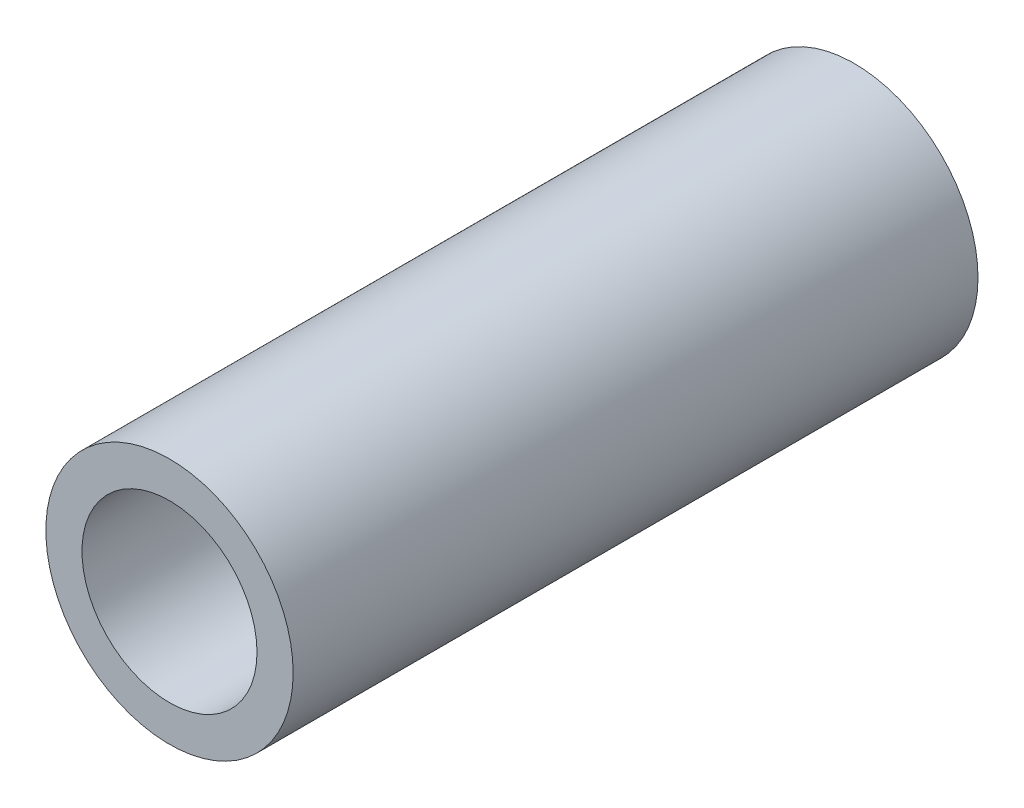
ISO-10303-21;
HEADER;
FILE_DESCRIPTION(('STEP AP214'),'2;1');
FILE_NAME('part.step','',(''),(''),'','','');
FILE_SCHEMA(('AUTOMOTIVE_DESIGN { 1 0 10303 214 1 1 1 1 }'));
ENDSEC;
DATA;
#1=APPLICATION_CONTEXT('core data for automotive mechanical design processes');
#2=APPLICATION_PROTOCOL_DEFINITION('international standard','automotive_design',2000,#1);
#3=PRODUCT_CONTEXT('',#1,'mechanical');
#4=PRODUCT('Part','Part','',(#3));
#5=PRODUCT_RELATED_PRODUCT_CATEGORY('part','',(#4));
#6=PRODUCT_DEFINITION_FORMATION('','',#4);
#7=PRODUCT_DEFINITION_CONTEXT('part definition',#1,'design');
#8=PRODUCT_DEFINITION('design','',#6,#7);
#9=PRODUCT_DEFINITION_SHAPE('','',#8);
#10=(LENGTH_UNIT() NAMED_UNIT(*) SI_UNIT(.MILLI.,.METRE.));
#11=(NAMED_UNIT(*) PLANE_ANGLE_UNIT() SI_UNIT($,.RADIAN.));
#12=(NAMED_UNIT(*) SI_UNIT($,.STERADIAN.) SOLID_ANGLE_UNIT());
#13=UNCERTAINTY_MEASURE_WITH_UNIT(LENGTH_MEASURE(1.E-05),#10,'distance_accuracy_value','');
#14=(GEOMETRIC_REPRESENTATION_CONTEXT(3) GLOBAL_UNCERTAINTY_ASSIGNED_CONTEXT((#13)) GLOBAL_UNIT_ASSIGNED_CONTEXT((#10,
#11,#12)) REPRESENTATION_CONTEXT('',''));
#15=CARTESIAN_POINT('',(0.,0.,0.));
#16=DIRECTION('',(0.,0.,1.));
#17=DIRECTION('',(1.,0.,0.));
#18=AXIS2_PLACEMENT_3D('',#15,#16,#17);
#19=CARTESIAN_POINT('',(0.,0.,18.));
#20=DIRECTION('',(0.,0.,1.));
#21=DIRECTION('',(1.,0.,0.));
#22=AXIS2_PLACEMENT_3D('',#19,#20,#21);
#23=PLANE('',#22);
#24=CARTESIAN_POINT('',(0.,0.,18.));
#25=DIRECTION('',(0.,0.,1.));
#26=DIRECTION('',(1.,0.,0.));
#27=AXIS2_PLACEMENT_3D('',#24,#25,#26);
#28=CIRCLE('',#27,3.25);
#29=CARTESIAN_POINT('',(3.25,0.,18.));
#30=VERTEX_POINT('',#29);
#31=EDGE_CURVE('E10',#30,#30,#28,.T.);
#32=ORIENTED_EDGE('',*,*,#31,.T.);
#33=EDGE_LOOP('',(#32));
#34=FACE_BOUND('',#33,.T.);
#35=CARTESIAN_POINT('',(0.,0.,18.));
#36=DIRECTION('',(0.,0.,1.));
#37=DIRECTION('',(1.,0.,0.));
#38=AXIS2_PLACEMENT_3D('',#35,#36,#37);
#39=CIRCLE('',#38,2.3);
#40=CARTESIAN_POINT('',(2.3,0.,18.));
#41=VERTEX_POINT('',#40);
#42=EDGE_CURVE('E48',#41,#41,#39,.T.);
#43=ORIENTED_EDGE('',*,*,#42,.F.);
#44=EDGE_LOOP('',(#43));
#45=FACE_BOUND('',#44,.T.);
#46=ADVANCED_FACE('F37',(#34,#45),#23,.T.);
#47=CARTESIAN_POINT('',(0.,0.,0.));
#48=DIRECTION('',(0.,0.,1.));
#49=DIRECTION('',(1.,0.,0.));
#50=AXIS2_PLACEMENT_3D('',#47,#48,#49);
#51=PLANE('',#50);
#52=CARTESIAN_POINT('',(0.,0.,0.));
#53=DIRECTION('',(0.,0.,1.));
#54=DIRECTION('',(1.,0.,0.));
#55=AXIS2_PLACEMENT_3D('',#52,#53,#54);
#56=CIRCLE('',#55,3.25);
#57=CARTESIAN_POINT('',(3.25,0.,0.));
#58=VERTEX_POINT('',#57);
#59=EDGE_CURVE('E41',#58,#58,#56,.T.);
#60=ORIENTED_EDGE('',*,*,#59,.F.);
#61=EDGE_LOOP('',(#60));
#62=FACE_BOUND('',#61,.T.);
#63=CARTESIAN_POINT('',(0.,0.,0.));
#64=DIRECTION('',(0.,0.,1.));
#65=DIRECTION('',(1.,0.,0.));
#66=AXIS2_PLACEMENT_3D('',#63,#64,#65);
#67=CIRCLE('',#66,2.3);
#68=CARTESIAN_POINT('',(2.3,0.,0.));
#69=VERTEX_POINT('',#68);
#70=EDGE_CURVE('E50',#69,#69,#67,.T.);
#71=ORIENTED_EDGE('',*,*,#70,.T.);
#72=EDGE_LOOP('',(#71));
#73=FACE_BOUND('',#72,.T.);
#74=ADVANCED_FACE('F60',(#62,#73),#51,.F.);
#75=CARTESIAN_POINT('',(0.,0.,18.));
#76=DIRECTION('',(0.,0.,-1.));
#77=DIRECTION('',(-1.,0.,0.));
#78=AXIS2_PLACEMENT_3D('',#75,#76,#77);
#79=CYLINDRICAL_SURFACE('',#78,3.25);
#80=ORIENTED_EDGE('',*,*,#31,.F.);
#81=EDGE_LOOP('',(#80));
#82=FACE_BOUND('',#81,.T.);
#83=ORIENTED_EDGE('',*,*,#59,.T.);
#84=EDGE_LOOP('',(#83));
#85=FACE_BOUND('',#84,.T.);
#86=ADVANCED_FACE('F39',(#82,#85),#79,.T.);
#87=CARTESIAN_POINT('',(0.,0.,18.));
#88=DIRECTION('',(0.,0.,-1.));
#89=DIRECTION('',(-1.,0.,0.));
#90=AXIS2_PLACEMENT_3D('',#87,#88,#89);
#91=CYLINDRICAL_SURFACE('',#90,2.3);
#92=ORIENTED_EDGE('',*,*,#42,.T.);
#93=EDGE_LOOP('',(#92));
#94=FACE_BOUND('',#93,.T.);
#95=ORIENTED_EDGE('',*,*,#70,.F.);
#96=EDGE_LOOP('',(#95));
#97=FACE_BOUND('',#96,.T.);
#98=ADVANCED_FACE('F56',(#94,#97),#91,.F.);
#99=CLOSED_SHELL('',(#46,#74,#86,#98));
#100=MANIFOLD_SOLID_BREP('B2',#99);
#101=ADVANCED_BREP_SHAPE_REPRESENTATION('',(#18,#100),#14);
#102=SHAPE_DEFINITION_REPRESENTATION(#9,#101);
ENDSEC;
END-ISO-10303-21;
